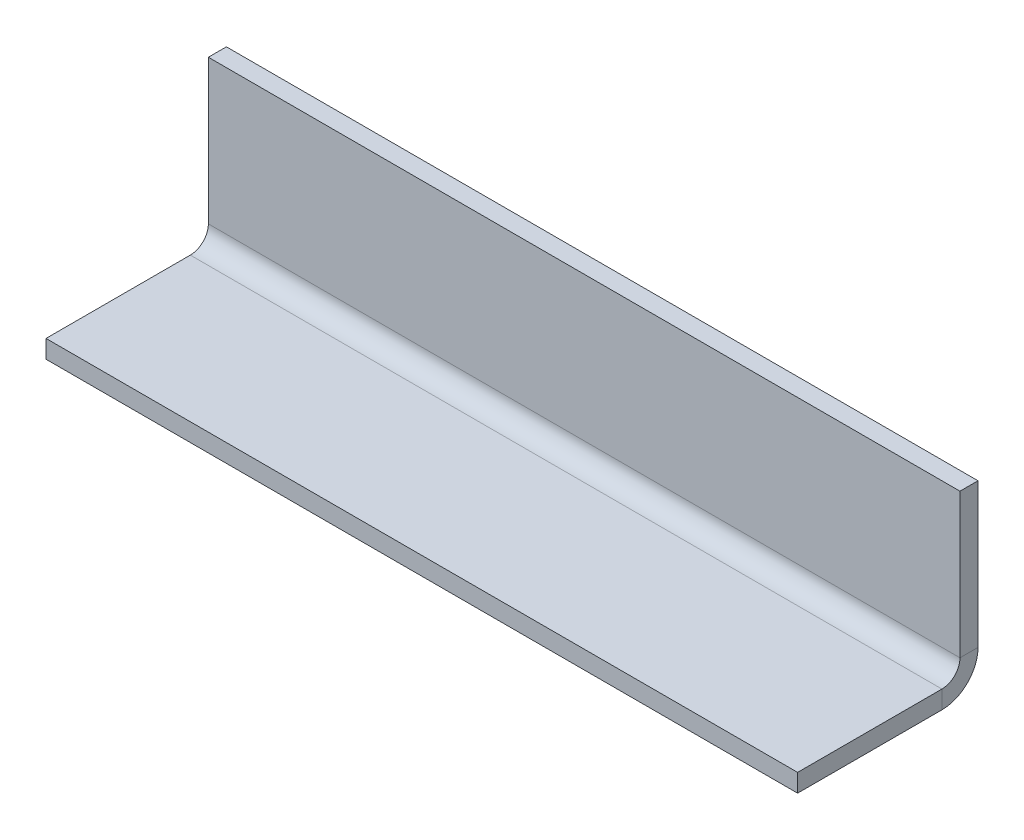
ISO-10303-21;
HEADER;
FILE_DESCRIPTION(('STEP AP214'),'2;1');
FILE_NAME('part.step','',(''),(''),'','','');
FILE_SCHEMA(('AUTOMOTIVE_DESIGN { 1 0 10303 214 1 1 1 1 }'));
ENDSEC;
DATA;
#1=APPLICATION_CONTEXT('core data for automotive mechanical design processes');
#2=APPLICATION_PROTOCOL_DEFINITION('international standard','automotive_design',2000,#1);
#3=PRODUCT_CONTEXT('',#1,'mechanical');
#4=PRODUCT('Part','Part','',(#3));
#5=PRODUCT_RELATED_PRODUCT_CATEGORY('part','',(#4));
#6=PRODUCT_DEFINITION_FORMATION('','',#4);
#7=PRODUCT_DEFINITION_CONTEXT('part definition',#1,'design');
#8=PRODUCT_DEFINITION('design','',#6,#7);
#9=PRODUCT_DEFINITION_SHAPE('','',#8);
#10=(LENGTH_UNIT() NAMED_UNIT(*) SI_UNIT(.MILLI.,.METRE.));
#11=(NAMED_UNIT(*) PLANE_ANGLE_UNIT() SI_UNIT($,.RADIAN.));
#12=(NAMED_UNIT(*) SI_UNIT($,.STERADIAN.) SOLID_ANGLE_UNIT());
#13=UNCERTAINTY_MEASURE_WITH_UNIT(LENGTH_MEASURE(1.E-05),#10,'distance_accuracy_value','');
#14=(GEOMETRIC_REPRESENTATION_CONTEXT(3) GLOBAL_UNCERTAINTY_ASSIGNED_CONTEXT((#13)) GLOBAL_UNIT_ASSIGNED_CONTEXT((#10,
#11,#12)) REPRESENTATION_CONTEXT('',''));
#15=CARTESIAN_POINT('',(0.,0.,0.));
#16=DIRECTION('',(0.,0.,1.));
#17=DIRECTION('',(1.,0.,0.));
#18=AXIS2_PLACEMENT_3D('',#15,#16,#17);
#19=CARTESIAN_POINT('',(125.,4.,-30.));
#20=DIRECTION('',(1.,0.,0.));
#21=DIRECTION('',(0.,0.,1.));
#22=AXIS2_PLACEMENT_3D('',#19,#20,#21);
#23=PLANE('',#22);
#24=DIRECTION('',(0.,0.,1.));
#25=VECTOR('',#24,1.);
#26=CARTESIAN_POINT('',(125.,4.,-30.));
#27=LINE('',#26,#25);
#28=CARTESIAN_POINT('',(125.,4.,-18.));
#29=VERTEX_POINT('',#28);
#30=CARTESIAN_POINT('',(125.,4.,30.));
#31=VERTEX_POINT('',#30);
#32=EDGE_CURVE('E170',#29,#31,#27,.T.);
#33=ORIENTED_EDGE('',*,*,#32,.T.);
#34=DIRECTION('',(0.,1.,0.));
#35=VECTOR('',#34,1.);
#36=CARTESIAN_POINT('',(125.,4.,30.));
#37=LINE('',#36,#35);
#38=CARTESIAN_POINT('',(125.,-2.,30.));
#39=VERTEX_POINT('',#38);
#40=EDGE_CURVE('E11',#39,#31,#37,.T.);
#41=ORIENTED_EDGE('',*,*,#40,.F.);
#42=DIRECTION('',(0.,0.,-1.));
#43=VECTOR('',#42,1.);
#44=CARTESIAN_POINT('',(125.,-2.,0.));
#45=LINE('',#44,#43);
#46=CARTESIAN_POINT('',(125.,-2.00000000000003,-18.));
#47=VERTEX_POINT('',#46);
#48=EDGE_CURVE('E179',#47,#39,#45,.F.);
#49=ORIENTED_EDGE('',*,*,#48,.F.);
#50=DIRECTION('',(0.,-1.,0.));
#51=VECTOR('',#50,1.);
#52=CARTESIAN_POINT('',(125.,3.99999999999997,-18.));
#53=LINE('',#52,#51);
#54=EDGE_CURVE('E155',#29,#47,#53,.T.);
#55=ORIENTED_EDGE('',*,*,#54,.F.);
#56=EDGE_LOOP('',(#33,#41,#49,#55));
#57=FACE_BOUND('',#56,.T.);
#58=ADVANCED_FACE('F39',(#57),#23,.T.);
#59=CARTESIAN_POINT('',(0.,4.,0.));
#60=DIRECTION('',(0.,1.,0.));
#61=DIRECTION('',(0.,0.,-1.));
#62=AXIS2_PLACEMENT_3D('',#59,#60,#61);
#63=PLANE('',#62);
#64=DIRECTION('',(0.,0.,-1.));
#65=VECTOR('',#64,1.);
#66=CARTESIAN_POINT('',(-125.,4.,-30.));
#67=LINE('',#66,#65);
#68=CARTESIAN_POINT('',(-125.,4.,30.));
#69=VERTEX_POINT('',#68);
#70=CARTESIAN_POINT('',(-125.,4.,-18.));
#71=VERTEX_POINT('',#70);
#72=EDGE_CURVE('E167',#69,#71,#67,.T.);
#73=ORIENTED_EDGE('',*,*,#72,.F.);
#74=DIRECTION('',(-1.,0.,0.));
#75=VECTOR('',#74,1.);
#76=CARTESIAN_POINT('',(125.,4.,30.));
#77=LINE('',#76,#75);
#78=EDGE_CURVE('E174',#31,#69,#77,.T.);
#79=ORIENTED_EDGE('',*,*,#78,.F.);
#80=ORIENTED_EDGE('',*,*,#32,.F.);
#81=DIRECTION('',(1.,0.,0.));
#82=VECTOR('',#81,1.);
#83=CARTESIAN_POINT('',(125.,3.99999999999997,-18.));
#84=LINE('',#83,#82);
#85=EDGE_CURVE('E158',#29,#71,#84,.F.);
#86=ORIENTED_EDGE('',*,*,#85,.T.);
#87=EDGE_LOOP('',(#73,#79,#80,#86));
#88=FACE_BOUND('',#87,.T.);
#89=ADVANCED_FACE('F192',(#88),#63,.T.);
#90=CARTESIAN_POINT('',(0.,-2.,0.));
#91=DIRECTION('',(0.,1.,0.));
#92=DIRECTION('',(0.,0.,-1.));
#93=AXIS2_PLACEMENT_3D('',#90,#91,#92);
#94=PLANE('',#93);
#95=DIRECTION('',(1.,0.,0.));
#96=VECTOR('',#95,1.);
#97=CARTESIAN_POINT('',(125.,-2.00000000000003,-18.));
#98=LINE('',#97,#96);
#99=CARTESIAN_POINT('',(-125.,-2.,-18.));
#100=VERTEX_POINT('',#99);
#101=EDGE_CURVE('E149',#47,#100,#98,.F.);
#102=ORIENTED_EDGE('',*,*,#101,.F.);
#103=ORIENTED_EDGE('',*,*,#48,.T.);
#104=DIRECTION('',(1.,0.,0.));
#105=VECTOR('',#104,1.);
#106=CARTESIAN_POINT('',(0.,-2.,30.));
#107=LINE('',#106,#105);
#108=CARTESIAN_POINT('',(-125.,-2.,30.));
#109=VERTEX_POINT('',#108);
#110=EDGE_CURVE('E171',#39,#109,#107,.F.);
#111=ORIENTED_EDGE('',*,*,#110,.T.);
#112=DIRECTION('',(0.,0.,-1.));
#113=VECTOR('',#112,1.);
#114=CARTESIAN_POINT('',(-125.,-2.,0.));
#115=LINE('',#114,#113);
#116=EDGE_CURVE('E165',#109,#100,#115,.T.);
#117=ORIENTED_EDGE('',*,*,#116,.T.);
#118=EDGE_LOOP('',(#102,#103,#111,#117));
#119=FACE_BOUND('',#118,.T.);
#120=ADVANCED_FACE('F203',(#119),#94,.F.);
#121=CARTESIAN_POINT('',(125.,4.,30.));
#122=DIRECTION('',(0.,0.,1.));
#123=DIRECTION('',(-1.,0.,0.));
#124=AXIS2_PLACEMENT_3D('',#121,#122,#123);
#125=PLANE('',#124);
#126=ORIENTED_EDGE('',*,*,#40,.T.);
#127=ORIENTED_EDGE('',*,*,#78,.T.);
#128=DIRECTION('',(0.,1.,0.));
#129=VECTOR('',#128,1.);
#130=CARTESIAN_POINT('',(-125.,4.,30.));
#131=LINE('',#130,#129);
#132=EDGE_CURVE('E46',#109,#69,#131,.T.);
#133=ORIENTED_EDGE('',*,*,#132,.F.);
#134=ORIENTED_EDGE('',*,*,#110,.F.);
#135=EDGE_LOOP('',(#126,#127,#133,#134));
#136=FACE_BOUND('',#135,.T.);
#137=ADVANCED_FACE('F188',(#136),#125,.T.);
#138=CARTESIAN_POINT('',(-125.,4.,-30.));
#139=DIRECTION('',(-1.,0.,0.));
#140=DIRECTION('',(0.,0.,-1.));
#141=AXIS2_PLACEMENT_3D('',#138,#139,#140);
#142=PLANE('',#141);
#143=DIRECTION('',(0.,-1.,0.));
#144=VECTOR('',#143,1.);
#145=CARTESIAN_POINT('',(-125.,3.99999999999997,-18.));
#146=LINE('',#145,#144);
#147=EDGE_CURVE('E162',#71,#100,#146,.T.);
#148=ORIENTED_EDGE('',*,*,#147,.T.);
#149=ORIENTED_EDGE('',*,*,#116,.F.);
#150=ORIENTED_EDGE('',*,*,#132,.T.);
#151=ORIENTED_EDGE('',*,*,#72,.T.);
#152=EDGE_LOOP('',(#148,#149,#150,#151));
#153=FACE_BOUND('',#152,.T.);
#154=ADVANCED_FACE('F185',(#153),#142,.T.);
#155=CARTESIAN_POINT('',(-125.,9.99999999999997,-18.));
#156=DIRECTION('',(-1.,0.,0.));
#157=DIRECTION('',(0.,0.,-1.));
#158=AXIS2_PLACEMENT_3D('',#155,#156,#157);
#159=PLANE('',#158);
#160=DIRECTION('',(0.,0.,1.));
#161=VECTOR('',#160,1.);
#162=CARTESIAN_POINT('',(-125.,9.99999999999997,-30.));
#163=LINE('',#162,#161);
#164=CARTESIAN_POINT('',(-125.,9.99999999999997,-24.));
#165=VERTEX_POINT('',#164);
#166=CARTESIAN_POINT('',(-125.,9.99999999999997,-30.));
#167=VERTEX_POINT('',#166);
#168=EDGE_CURVE('E146',#165,#167,#163,.F.);
#169=ORIENTED_EDGE('',*,*,#168,.T.);
#170=CARTESIAN_POINT('',(-125.,9.99999999999997,-18.));
#171=DIRECTION('',(-1.,0.,0.));
#172=DIRECTION('',(0.,0.,1.));
#173=AXIS2_PLACEMENT_3D('',#170,#171,#172);
#174=CIRCLE('',#173,12.);
#175=EDGE_CURVE('E152',#100,#167,#174,.F.);
#176=ORIENTED_EDGE('',*,*,#175,.F.);
#177=ORIENTED_EDGE('',*,*,#147,.F.);
#178=CARTESIAN_POINT('',(-125.,9.99999999999997,-18.));
#179=DIRECTION('',(-1.,0.,0.));
#180=DIRECTION('',(0.,0.,1.));
#181=AXIS2_PLACEMENT_3D('',#178,#179,#180);
#182=CIRCLE('',#181,6.);
#183=EDGE_CURVE('E60',#71,#165,#182,.F.);
#184=ORIENTED_EDGE('',*,*,#183,.T.);
#185=EDGE_LOOP('',(#169,#176,#177,#184));
#186=FACE_BOUND('',#185,.T.);
#187=ADVANCED_FACE('F242',(#186),#159,.T.);
#188=CARTESIAN_POINT('',(125.,9.99999999999997,-18.));
#189=DIRECTION('',(-1.,0.,0.));
#190=DIRECTION('',(0.,0.,-1.));
#191=AXIS2_PLACEMENT_3D('',#188,#189,#190);
#192=PLANE('',#191);
#193=CARTESIAN_POINT('',(125.,9.99999999999997,-18.));
#194=DIRECTION('',(-1.,0.,0.));
#195=DIRECTION('',(0.,0.,1.));
#196=AXIS2_PLACEMENT_3D('',#193,#194,#195);
#197=CIRCLE('',#196,6.);
#198=CARTESIAN_POINT('',(125.,9.99999999999997,-24.));
#199=VERTEX_POINT('',#198);
#200=EDGE_CURVE('E53',#199,#29,#197,.T.);
#201=ORIENTED_EDGE('',*,*,#200,.T.);
#202=ORIENTED_EDGE('',*,*,#54,.T.);
#203=CARTESIAN_POINT('',(125.,9.99999999999997,-18.));
#204=DIRECTION('',(-1.,0.,0.));
#205=DIRECTION('',(0.,0.,1.));
#206=AXIS2_PLACEMENT_3D('',#203,#204,#205);
#207=CIRCLE('',#206,12.);
#208=CARTESIAN_POINT('',(125.,9.99999999999997,-30.));
#209=VERTEX_POINT('',#208);
#210=EDGE_CURVE('E153',#209,#47,#207,.T.);
#211=ORIENTED_EDGE('',*,*,#210,.F.);
#212=DIRECTION('',(0.,0.,1.));
#213=VECTOR('',#212,1.);
#214=CARTESIAN_POINT('',(125.,9.99999999999997,-24.));
#215=LINE('',#214,#213);
#216=EDGE_CURVE('E140',#199,#209,#215,.F.);
#217=ORIENTED_EDGE('',*,*,#216,.F.);
#218=EDGE_LOOP('',(#201,#202,#211,#217));
#219=FACE_BOUND('',#218,.T.);
#220=ADVANCED_FACE('F198',(#219),#192,.F.);
#221=CARTESIAN_POINT('',(125.,9.99999999999997,-18.));
#222=DIRECTION('',(1.,0.,0.));
#223=DIRECTION('',(0.,0.,-1.));
#224=AXIS2_PLACEMENT_3D('',#221,#222,#223);
#225=CYLINDRICAL_SURFACE('',#224,12.);
#226=ORIENTED_EDGE('',*,*,#101,.T.);
#227=ORIENTED_EDGE('',*,*,#175,.T.);
#228=DIRECTION('',(1.,0.,0.));
#229=VECTOR('',#228,1.);
#230=CARTESIAN_POINT('',(-125.,9.99999999999997,-30.));
#231=LINE('',#230,#229);
#232=EDGE_CURVE('E122',#209,#167,#231,.F.);
#233=ORIENTED_EDGE('',*,*,#232,.F.);
#234=ORIENTED_EDGE('',*,*,#210,.T.);
#235=EDGE_LOOP('',(#226,#227,#233,#234));
#236=FACE_BOUND('',#235,.T.);
#237=ADVANCED_FACE('F201',(#236),#225,.T.);
#238=CARTESIAN_POINT('',(125.,9.99999999999997,-18.));
#239=DIRECTION('',(1.,0.,0.));
#240=DIRECTION('',(0.,0.,-1.));
#241=AXIS2_PLACEMENT_3D('',#238,#239,#240);
#242=CYLINDRICAL_SURFACE('',#241,6.);
#243=ORIENTED_EDGE('',*,*,#85,.F.);
#244=ORIENTED_EDGE('',*,*,#200,.F.);
#245=DIRECTION('',(1.,0.,0.));
#246=VECTOR('',#245,1.);
#247=CARTESIAN_POINT('',(-125.,9.99999999999997,-24.));
#248=LINE('',#247,#246);
#249=EDGE_CURVE('E143',#165,#199,#248,.T.);
#250=ORIENTED_EDGE('',*,*,#249,.F.);
#251=ORIENTED_EDGE('',*,*,#183,.F.);
#252=EDGE_LOOP('',(#243,#244,#250,#251));
#253=FACE_BOUND('',#252,.T.);
#254=ADVANCED_FACE('F194',(#253),#242,.F.);
#255=CARTESIAN_POINT('',(-125.,4.,-30.));
#256=DIRECTION('',(1.,0.,0.));
#257=DIRECTION('',(0.,0.,1.));
#258=AXIS2_PLACEMENT_3D('',#255,#256,#257);
#259=PLANE('',#258);
#260=ORIENTED_EDGE('',*,*,#168,.F.);
#261=DIRECTION('',(0.,1.,0.));
#262=VECTOR('',#261,1.);
#263=CARTESIAN_POINT('',(-125.,4.,-24.));
#264=LINE('',#263,#262);
#265=CARTESIAN_POINT('',(-125.,58.,-24.));
#266=VERTEX_POINT('',#265);
#267=EDGE_CURVE('E129',#266,#165,#264,.F.);
#268=ORIENTED_EDGE('',*,*,#267,.F.);
#269=DIRECTION('',(0.,0.,1.));
#270=VECTOR('',#269,1.);
#271=CARTESIAN_POINT('',(-125.,58.,-30.));
#272=LINE('',#271,#270);
#273=CARTESIAN_POINT('',(-125.,58.,-30.));
#274=VERTEX_POINT('',#273);
#275=EDGE_CURVE('E110',#274,#266,#272,.T.);
#276=ORIENTED_EDGE('',*,*,#275,.F.);
#277=DIRECTION('',(0.,-1.,0.));
#278=VECTOR('',#277,1.);
#279=CARTESIAN_POINT('',(-125.,0.,-30.));
#280=LINE('',#279,#278);
#281=EDGE_CURVE('E119',#274,#167,#280,.T.);
#282=ORIENTED_EDGE('',*,*,#281,.T.);
#283=EDGE_LOOP('',(#260,#268,#276,#282));
#284=FACE_BOUND('',#283,.T.);
#285=ADVANCED_FACE('F128',(#284),#259,.F.);
#286=CARTESIAN_POINT('',(125.,58.,-30.));
#287=DIRECTION('',(-1.,0.,0.));
#288=DIRECTION('',(0.,0.,-1.));
#289=AXIS2_PLACEMENT_3D('',#286,#287,#288);
#290=PLANE('',#289);
#291=ORIENTED_EDGE('',*,*,#216,.T.);
#292=DIRECTION('',(0.,1.,0.));
#293=VECTOR('',#292,1.);
#294=CARTESIAN_POINT('',(125.,0.,-30.));
#295=LINE('',#294,#293);
#296=CARTESIAN_POINT('',(125.,58.,-30.));
#297=VERTEX_POINT('',#296);
#298=EDGE_CURVE('E116',#209,#297,#295,.T.);
#299=ORIENTED_EDGE('',*,*,#298,.T.);
#300=DIRECTION('',(0.,0.,1.));
#301=VECTOR('',#300,1.);
#302=CARTESIAN_POINT('',(125.,58.,-30.));
#303=LINE('',#302,#301);
#304=CARTESIAN_POINT('',(125.,58.,-24.));
#305=VERTEX_POINT('',#304);
#306=EDGE_CURVE('E113',#297,#305,#303,.T.);
#307=ORIENTED_EDGE('',*,*,#306,.T.);
#308=DIRECTION('',(0.,-1.,0.));
#309=VECTOR('',#308,1.);
#310=CARTESIAN_POINT('',(125.,58.,-24.));
#311=LINE('',#310,#309);
#312=EDGE_CURVE('E135',#199,#305,#311,.F.);
#313=ORIENTED_EDGE('',*,*,#312,.F.);
#314=EDGE_LOOP('',(#291,#299,#307,#313));
#315=FACE_BOUND('',#314,.T.);
#316=ADVANCED_FACE('F287',(#315),#290,.F.);
#317=CARTESIAN_POINT('',(0.,0.,-30.));
#318=DIRECTION('',(0.,0.,1.));
#319=DIRECTION('',(-1.,0.,0.));
#320=AXIS2_PLACEMENT_3D('',#317,#318,#319);
#321=PLANE('',#320);
#322=ORIENTED_EDGE('',*,*,#232,.T.);
#323=ORIENTED_EDGE('',*,*,#281,.F.);
#324=DIRECTION('',(-1.,0.,0.));
#325=VECTOR('',#324,1.);
#326=CARTESIAN_POINT('',(0.,58.,-30.));
#327=LINE('',#326,#325);
#328=EDGE_CURVE('E106',#297,#274,#327,.T.);
#329=ORIENTED_EDGE('',*,*,#328,.F.);
#330=ORIENTED_EDGE('',*,*,#298,.F.);
#331=EDGE_LOOP('',(#322,#323,#329,#330));
#332=FACE_BOUND('',#331,.T.);
#333=ADVANCED_FACE('F120',(#332),#321,.F.);
#334=CARTESIAN_POINT('',(0.,0.,-24.));
#335=DIRECTION('',(0.,0.,1.));
#336=DIRECTION('',(-1.,0.,0.));
#337=AXIS2_PLACEMENT_3D('',#334,#335,#336);
#338=PLANE('',#337);
#339=ORIENTED_EDGE('',*,*,#312,.T.);
#340=DIRECTION('',(1.,0.,0.));
#341=VECTOR('',#340,1.);
#342=CARTESIAN_POINT('',(-125.,58.,-24.));
#343=LINE('',#342,#341);
#344=EDGE_CURVE('E126',#305,#266,#343,.F.);
#345=ORIENTED_EDGE('',*,*,#344,.T.);
#346=ORIENTED_EDGE('',*,*,#267,.T.);
#347=ORIENTED_EDGE('',*,*,#249,.T.);
#348=EDGE_LOOP('',(#339,#345,#346,#347));
#349=FACE_BOUND('',#348,.T.);
#350=ADVANCED_FACE('F307',(#349),#338,.T.);
#351=CARTESIAN_POINT('',(-125.,58.,-30.));
#352=DIRECTION('',(0.,-1.,0.));
#353=DIRECTION('',(0.,0.,1.));
#354=AXIS2_PLACEMENT_3D('',#351,#352,#353);
#355=PLANE('',#354);
#356=ORIENTED_EDGE('',*,*,#344,.F.);
#357=ORIENTED_EDGE('',*,*,#306,.F.);
#358=ORIENTED_EDGE('',*,*,#328,.T.);
#359=ORIENTED_EDGE('',*,*,#275,.T.);
#360=EDGE_LOOP('',(#356,#357,#358,#359));
#361=FACE_BOUND('',#360,.T.);
#362=ADVANCED_FACE('F108',(#361),#355,.F.);
#363=CLOSED_SHELL('',(#58,#89,#120,#137,#154,#187,#220,#237,#254,#285,#316,#333,#350,#362));
#364=MANIFOLD_SOLID_BREP('B2',#363);
#365=ADVANCED_BREP_SHAPE_REPRESENTATION('',(#18,#364),#14);
#366=SHAPE_DEFINITION_REPRESENTATION(#9,#365);
ENDSEC;
END-ISO-10303-21;
